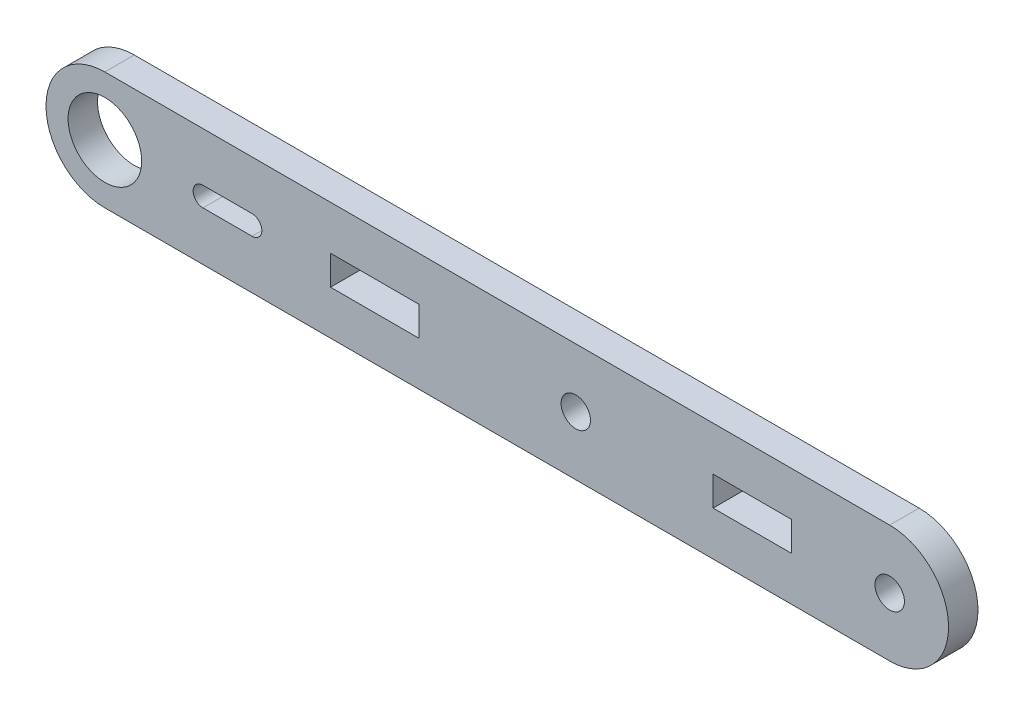
ISO-10303-21;
HEADER;
FILE_DESCRIPTION(('STEP AP214'),'2;1');
FILE_NAME('part.step','',(''),(''),'','','');
FILE_SCHEMA(('AUTOMOTIVE_DESIGN { 1 0 10303 214 1 1 1 1 }'));
ENDSEC;
DATA;
#1=APPLICATION_CONTEXT('core data for automotive mechanical design processes');
#2=APPLICATION_PROTOCOL_DEFINITION('international standard','automotive_design',2000,#1);
#3=PRODUCT_CONTEXT('',#1,'mechanical');
#4=PRODUCT('Part','Part','',(#3));
#5=PRODUCT_RELATED_PRODUCT_CATEGORY('part','',(#4));
#6=PRODUCT_DEFINITION_FORMATION('','',#4);
#7=PRODUCT_DEFINITION_CONTEXT('part definition',#1,'design');
#8=PRODUCT_DEFINITION('design','',#6,#7);
#9=PRODUCT_DEFINITION_SHAPE('','',#8);
#10=(LENGTH_UNIT() NAMED_UNIT(*) SI_UNIT(.MILLI.,.METRE.));
#11=(NAMED_UNIT(*) PLANE_ANGLE_UNIT() SI_UNIT($,.RADIAN.));
#12=(NAMED_UNIT(*) SI_UNIT($,.STERADIAN.) SOLID_ANGLE_UNIT());
#13=UNCERTAINTY_MEASURE_WITH_UNIT(LENGTH_MEASURE(1.E-05),#10,'distance_accuracy_value','');
#14=(GEOMETRIC_REPRESENTATION_CONTEXT(3) GLOBAL_UNCERTAINTY_ASSIGNED_CONTEXT((#13)) GLOBAL_UNIT_ASSIGNED_CONTEXT((#10,
#11,#12)) REPRESENTATION_CONTEXT('',''));
#15=CARTESIAN_POINT('',(0.,0.,0.));
#16=DIRECTION('',(0.,0.,1.));
#17=DIRECTION('',(1.,0.,0.));
#18=AXIS2_PLACEMENT_3D('',#15,#16,#17);
#19=CARTESIAN_POINT('',(-63.0402925118679,-53.50506394828,3.));
#20=DIRECTION('',(0.,0.,1.));
#21=DIRECTION('',(1.,0.,0.));
#22=AXIS2_PLACEMENT_3D('',#19,#20,#21);
#23=PLANE('',#22);
#24=DIRECTION('',(-1.,0.,0.));
#25=VECTOR('',#24,1.);
#26=CARTESIAN_POINT('',(6.95970748813215,-52.00506394828,3.));
#27=LINE('',#26,#25);
#28=CARTESIAN_POINT('',(6.95970748813215,-52.00506394828,3.));
#29=VERTEX_POINT('',#28);
#30=CARTESIAN_POINT('',(-1.04029251186785,-52.00506394828,3.));
#31=VERTEX_POINT('',#30);
#32=EDGE_CURVE('E185',#29,#31,#27,.T.);
#33=ORIENTED_EDGE('',*,*,#32,.F.);
#34=DIRECTION('',(0.,1.,0.));
#35=VECTOR('',#34,1.);
#36=CARTESIAN_POINT('',(6.95970748813215,-55.00506394828,3.));
#37=LINE('',#36,#35);
#38=CARTESIAN_POINT('',(6.95970748813215,-55.00506394828,3.));
#39=VERTEX_POINT('',#38);
#40=EDGE_CURVE('E183',#39,#29,#37,.T.);
#41=ORIENTED_EDGE('',*,*,#40,.F.);
#42=DIRECTION('',(1.,0.,0.));
#43=VECTOR('',#42,1.);
#44=CARTESIAN_POINT('',(6.95970748813215,-55.00506394828,3.));
#45=LINE('',#44,#43);
#46=CARTESIAN_POINT('',(-1.04029251186784,-55.00506394828,3.));
#47=VERTEX_POINT('',#46);
#48=EDGE_CURVE('E191',#47,#39,#45,.T.);
#49=ORIENTED_EDGE('',*,*,#48,.F.);
#50=DIRECTION('',(0.,-1.,0.));
#51=VECTOR('',#50,1.);
#52=CARTESIAN_POINT('',(-1.04029251186785,-55.00506394828,3.));
#53=LINE('',#52,#51);
#54=EDGE_CURVE('E188',#31,#47,#53,.T.);
#55=ORIENTED_EDGE('',*,*,#54,.F.);
#56=EDGE_LOOP('',(#33,#41,#49,#55));
#57=FACE_BOUND('',#56,.T.);
#58=CARTESIAN_POINT('',(-63.0402925118679,-53.50506394828,3.));
#59=DIRECTION('',(0.,0.,1.));
#60=DIRECTION('',(1.,0.,0.));
#61=AXIS2_PLACEMENT_3D('',#58,#59,#60);
#62=CIRCLE('',#61,3.75000000000001);
#63=CARTESIAN_POINT('',(-59.2902925118678,-53.50506394828,3.));
#64=VERTEX_POINT('',#63);
#65=EDGE_CURVE('E245',#64,#64,#62,.T.);
#66=ORIENTED_EDGE('',*,*,#65,.F.);
#67=EDGE_LOOP('',(#66));
#68=FACE_BOUND('',#67,.T.);
#69=CARTESIAN_POINT('',(-15.0402925118679,-53.50506394828,3.));
#70=DIRECTION('',(0.,0.,1.));
#71=DIRECTION('',(1.,0.,0.));
#72=AXIS2_PLACEMENT_3D('',#69,#70,#71);
#73=CIRCLE('',#72,1.5);
#74=CARTESIAN_POINT('',(-13.5402925118679,-53.50506394828,3.));
#75=VERTEX_POINT('',#74);
#76=EDGE_CURVE('E257',#75,#75,#73,.T.);
#77=ORIENTED_EDGE('',*,*,#76,.F.);
#78=EDGE_LOOP('',(#77));
#79=FACE_BOUND('',#78,.T.);
#80=CARTESIAN_POINT('',(-63.0402925118679,-53.50506394828,3.));
#81=DIRECTION('',(0.,0.,1.));
#82=DIRECTION('',(1.,0.,0.));
#83=AXIS2_PLACEMENT_3D('',#80,#81,#82);
#84=CIRCLE('',#83,6.);
#85=CARTESIAN_POINT('',(-63.0402925118679,-47.50506394828,3.));
#86=VERTEX_POINT('',#85);
#87=CARTESIAN_POINT('',(-63.0402925118679,-59.50506394828,3.));
#88=VERTEX_POINT('',#87);
#89=EDGE_CURVE('E263',#86,#88,#84,.T.);
#90=ORIENTED_EDGE('',*,*,#89,.T.);
#91=DIRECTION('',(1.,0.,0.));
#92=VECTOR('',#91,1.);
#93=CARTESIAN_POINT('',(-63.0402925118679,-59.50506394828,3.));
#94=LINE('',#93,#92);
#95=CARTESIAN_POINT('',(16.9597074881321,-59.50506394828,3.));
#96=VERTEX_POINT('',#95);
#97=EDGE_CURVE('E266',#88,#96,#94,.T.);
#98=ORIENTED_EDGE('',*,*,#97,.T.);
#99=CARTESIAN_POINT('',(16.9597074881321,-53.50506394828,3.));
#100=DIRECTION('',(0.,0.,1.));
#101=DIRECTION('',(1.,0.,0.));
#102=AXIS2_PLACEMENT_3D('',#99,#100,#101);
#103=CIRCLE('',#102,6.00000000000001);
#104=CARTESIAN_POINT('',(16.9597074881321,-47.50506394828,3.));
#105=VERTEX_POINT('',#104);
#106=EDGE_CURVE('E269',#96,#105,#103,.T.);
#107=ORIENTED_EDGE('',*,*,#106,.T.);
#108=DIRECTION('',(-1.,0.,0.));
#109=VECTOR('',#108,1.);
#110=CARTESIAN_POINT('',(-63.0402925118679,-47.50506394828,3.));
#111=LINE('',#110,#109);
#112=EDGE_CURVE('E271',#105,#86,#111,.T.);
#113=ORIENTED_EDGE('',*,*,#112,.T.);
#114=EDGE_LOOP('',(#90,#98,#107,#113));
#115=FACE_BOUND('',#114,.T.);
#116=CARTESIAN_POINT('',(16.9597074881321,-53.50506394828,3.));
#117=DIRECTION('',(0.,0.,1.));
#118=DIRECTION('',(1.,0.,0.));
#119=AXIS2_PLACEMENT_3D('',#116,#117,#118);
#120=CIRCLE('',#119,1.50000000000002);
#121=CARTESIAN_POINT('',(18.4597074881322,-53.50506394828,3.));
#122=VERTEX_POINT('',#121);
#123=EDGE_CURVE('E251',#122,#122,#120,.T.);
#124=ORIENTED_EDGE('',*,*,#123,.F.);
#125=EDGE_LOOP('',(#124));
#126=FACE_BOUND('',#125,.T.);
#127=DIRECTION('',(-1.,0.,0.));
#128=VECTOR('',#127,1.);
#129=CARTESIAN_POINT('',(-31.0402925118678,-52.00506394828,3.));
#130=LINE('',#129,#128);
#131=CARTESIAN_POINT('',(-31.0402925118678,-52.00506394828,3.));
#132=VERTEX_POINT('',#131);
#133=CARTESIAN_POINT('',(-40.0402925118678,-52.00506394828,3.));
#134=VERTEX_POINT('',#133);
#135=EDGE_CURVE('E216',#132,#134,#130,.T.);
#136=ORIENTED_EDGE('',*,*,#135,.F.);
#137=DIRECTION('',(0.,1.,0.));
#138=VECTOR('',#137,1.);
#139=CARTESIAN_POINT('',(-31.0402925118678,-55.00506394828,3.));
#140=LINE('',#139,#138);
#141=CARTESIAN_POINT('',(-31.0402925118678,-55.00506394828,3.));
#142=VERTEX_POINT('',#141);
#143=EDGE_CURVE('E214',#142,#132,#140,.T.);
#144=ORIENTED_EDGE('',*,*,#143,.F.);
#145=DIRECTION('',(1.,0.,0.));
#146=VECTOR('',#145,1.);
#147=CARTESIAN_POINT('',(-31.0402925118678,-55.00506394828,3.));
#148=LINE('',#147,#146);
#149=CARTESIAN_POINT('',(-40.0402925118678,-55.00506394828,3.));
#150=VERTEX_POINT('',#149);
#151=EDGE_CURVE('E222',#150,#142,#148,.T.);
#152=ORIENTED_EDGE('',*,*,#151,.F.);
#153=DIRECTION('',(0.,-1.,0.));
#154=VECTOR('',#153,1.);
#155=CARTESIAN_POINT('',(-40.0402925118678,-55.00506394828,3.));
#156=LINE('',#155,#154);
#157=EDGE_CURVE('E219',#134,#150,#156,.T.);
#158=ORIENTED_EDGE('',*,*,#157,.F.);
#159=EDGE_LOOP('',(#136,#144,#152,#158));
#160=FACE_BOUND('',#159,.T.);
#161=DIRECTION('',(1.,0.,0.));
#162=VECTOR('',#161,1.);
#163=CARTESIAN_POINT('',(-53.0402925118678,-54.50506394828,3.));
#164=LINE('',#163,#162);
#165=CARTESIAN_POINT('',(-53.0402925118678,-54.50506394828,3.));
#166=VERTEX_POINT('',#165);
#167=CARTESIAN_POINT('',(-48.0402925118679,-54.50506394828,3.));
#168=VERTEX_POINT('',#167);
#169=EDGE_CURVE('E155',#166,#168,#164,.T.);
#170=ORIENTED_EDGE('',*,*,#169,.F.);
#171=CARTESIAN_POINT('',(-53.0402925118678,-53.50506394828,3.));
#172=DIRECTION('',(0.,0.,1.));
#173=DIRECTION('',(1.,0.,0.));
#174=AXIS2_PLACEMENT_3D('',#171,#172,#173);
#175=CIRCLE('',#174,1.);
#176=CARTESIAN_POINT('',(-53.0402925118678,-52.50506394828,3.));
#177=VERTEX_POINT('',#176);
#178=EDGE_CURVE('E147',#177,#166,#175,.T.);
#179=ORIENTED_EDGE('',*,*,#178,.F.);
#180=DIRECTION('',(-1.,0.,0.));
#181=VECTOR('',#180,1.);
#182=CARTESIAN_POINT('',(-53.0402925118678,-52.50506394828,3.));
#183=LINE('',#182,#181);
#184=CARTESIAN_POINT('',(-48.0402925118679,-52.50506394828,3.));
#185=VERTEX_POINT('',#184);
#186=EDGE_CURVE('E169',#185,#177,#183,.T.);
#187=ORIENTED_EDGE('',*,*,#186,.F.);
#188=CARTESIAN_POINT('',(-48.0402925118679,-53.50506394828,3.));
#189=DIRECTION('',(0.,0.,1.));
#190=DIRECTION('',(1.,0.,0.));
#191=AXIS2_PLACEMENT_3D('',#188,#189,#190);
#192=CIRCLE('',#191,1.);
#193=EDGE_CURVE('E167',#168,#185,#192,.T.);
#194=ORIENTED_EDGE('',*,*,#193,.F.);
#195=EDGE_LOOP('',(#170,#179,#187,#194));
#196=FACE_BOUND('',#195,.T.);
#197=ADVANCED_FACE('F34',(#57,#68,#79,#115,#126,#160,#196),#23,.T.);
#198=CARTESIAN_POINT('',(-63.0402925118679,-53.50506394828,0.));
#199=DIRECTION('',(0.,0.,1.));
#200=DIRECTION('',(1.,0.,0.));
#201=AXIS2_PLACEMENT_3D('',#198,#199,#200);
#202=PLANE('',#201);
#203=DIRECTION('',(0.,1.,0.));
#204=VECTOR('',#203,1.);
#205=CARTESIAN_POINT('',(6.95970748813215,-55.00506394828,0.));
#206=LINE('',#205,#204);
#207=CARTESIAN_POINT('',(6.95970748813216,-55.00506394828,0.));
#208=VERTEX_POINT('',#207);
#209=CARTESIAN_POINT('',(6.95970748813215,-52.00506394828,0.));
#210=VERTEX_POINT('',#209);
#211=EDGE_CURVE('E163',#208,#210,#206,.T.);
#212=ORIENTED_EDGE('',*,*,#211,.T.);
#213=DIRECTION('',(-1.,0.,0.));
#214=VECTOR('',#213,1.);
#215=CARTESIAN_POINT('',(6.95970748813215,-52.00506394828,0.));
#216=LINE('',#215,#214);
#217=CARTESIAN_POINT('',(-1.04029251186785,-52.00506394828,0.));
#218=VERTEX_POINT('',#217);
#219=EDGE_CURVE('E196',#210,#218,#216,.T.);
#220=ORIENTED_EDGE('',*,*,#219,.T.);
#221=DIRECTION('',(0.,-1.,0.));
#222=VECTOR('',#221,1.);
#223=CARTESIAN_POINT('',(-1.04029251186785,-55.00506394828,0.));
#224=LINE('',#223,#222);
#225=CARTESIAN_POINT('',(-1.04029251186785,-55.00506394828,0.));
#226=VERTEX_POINT('',#225);
#227=EDGE_CURVE('E199',#218,#226,#224,.T.);
#228=ORIENTED_EDGE('',*,*,#227,.T.);
#229=DIRECTION('',(1.,0.,0.));
#230=VECTOR('',#229,1.);
#231=CARTESIAN_POINT('',(6.95970748813215,-55.00506394828,0.));
#232=LINE('',#231,#230);
#233=EDGE_CURVE('E186',#226,#208,#232,.T.);
#234=ORIENTED_EDGE('',*,*,#233,.T.);
#235=EDGE_LOOP('',(#212,#220,#228,#234));
#236=FACE_BOUND('',#235,.T.);
#237=CARTESIAN_POINT('',(-63.0402925118679,-53.50506394828,0.));
#238=DIRECTION('',(0.,0.,1.));
#239=DIRECTION('',(1.,0.,0.));
#240=AXIS2_PLACEMENT_3D('',#237,#238,#239);
#241=CIRCLE('',#240,3.75000000000001);
#242=CARTESIAN_POINT('',(-59.2902925118678,-53.50506394828,0.));
#243=VERTEX_POINT('',#242);
#244=EDGE_CURVE('E244',#243,#243,#241,.T.);
#245=ORIENTED_EDGE('',*,*,#244,.T.);
#246=EDGE_LOOP('',(#245));
#247=FACE_BOUND('',#246,.T.);
#248=CARTESIAN_POINT('',(-15.0402925118679,-53.50506394828,0.));
#249=DIRECTION('',(0.,0.,1.));
#250=DIRECTION('',(1.,0.,0.));
#251=AXIS2_PLACEMENT_3D('',#248,#249,#250);
#252=CIRCLE('',#251,1.5);
#253=CARTESIAN_POINT('',(-13.5402925118679,-53.50506394828,0.));
#254=VERTEX_POINT('',#253);
#255=EDGE_CURVE('E254',#254,#254,#252,.T.);
#256=ORIENTED_EDGE('',*,*,#255,.T.);
#257=EDGE_LOOP('',(#256));
#258=FACE_BOUND('',#257,.T.);
#259=CARTESIAN_POINT('',(-63.0402925118679,-53.50506394828,0.));
#260=DIRECTION('',(0.,0.,1.));
#261=DIRECTION('',(1.,0.,0.));
#262=AXIS2_PLACEMENT_3D('',#259,#260,#261);
#263=CIRCLE('',#262,6.);
#264=CARTESIAN_POINT('',(-63.0402925118679,-47.50506394828,0.));
#265=VERTEX_POINT('',#264);
#266=CARTESIAN_POINT('',(-63.0402925118679,-59.50506394828,0.));
#267=VERTEX_POINT('',#266);
#268=EDGE_CURVE('E260',#265,#267,#263,.T.);
#269=ORIENTED_EDGE('',*,*,#268,.F.);
#270=DIRECTION('',(-1.,0.,0.));
#271=VECTOR('',#270,1.);
#272=CARTESIAN_POINT('',(-63.0402925118679,-47.50506394828,0.));
#273=LINE('',#272,#271);
#274=CARTESIAN_POINT('',(16.9597074881321,-47.50506394828,0.));
#275=VERTEX_POINT('',#274);
#276=EDGE_CURVE('E267',#275,#265,#273,.T.);
#277=ORIENTED_EDGE('',*,*,#276,.F.);
#278=CARTESIAN_POINT('',(16.9597074881321,-53.50506394828,0.));
#279=DIRECTION('',(0.,0.,1.));
#280=DIRECTION('',(1.,0.,0.));
#281=AXIS2_PLACEMENT_3D('',#278,#279,#280);
#282=CIRCLE('',#281,6.00000000000001);
#283=CARTESIAN_POINT('',(16.9597074881321,-59.50506394828,0.));
#284=VERTEX_POINT('',#283);
#285=EDGE_CURVE('E278',#284,#275,#282,.T.);
#286=ORIENTED_EDGE('',*,*,#285,.F.);
#287=DIRECTION('',(1.,0.,0.));
#288=VECTOR('',#287,1.);
#289=CARTESIAN_POINT('',(-63.0402925118679,-59.50506394828,0.));
#290=LINE('',#289,#288);
#291=EDGE_CURVE('E276',#267,#284,#290,.T.);
#292=ORIENTED_EDGE('',*,*,#291,.F.);
#293=EDGE_LOOP('',(#269,#277,#286,#292));
#294=FACE_BOUND('',#293,.T.);
#295=CARTESIAN_POINT('',(16.9597074881321,-53.50506394828,0.));
#296=DIRECTION('',(0.,0.,1.));
#297=DIRECTION('',(1.,0.,0.));
#298=AXIS2_PLACEMENT_3D('',#295,#296,#297);
#299=CIRCLE('',#298,1.50000000000002);
#300=CARTESIAN_POINT('',(18.4597074881322,-53.50506394828,0.));
#301=VERTEX_POINT('',#300);
#302=EDGE_CURVE('E248',#301,#301,#299,.T.);
#303=ORIENTED_EDGE('',*,*,#302,.T.);
#304=EDGE_LOOP('',(#303));
#305=FACE_BOUND('',#304,.T.);
#306=DIRECTION('',(0.,1.,0.));
#307=VECTOR('',#306,1.);
#308=CARTESIAN_POINT('',(-31.0402925118678,-55.00506394828,0.));
#309=LINE('',#308,#307);
#310=CARTESIAN_POINT('',(-31.0402925118679,-55.00506394828,0.));
#311=VERTEX_POINT('',#310);
#312=CARTESIAN_POINT('',(-31.0402925118678,-52.00506394828,0.));
#313=VERTEX_POINT('',#312);
#314=EDGE_CURVE('E213',#311,#313,#309,.T.);
#315=ORIENTED_EDGE('',*,*,#314,.T.);
#316=DIRECTION('',(-1.,0.,0.));
#317=VECTOR('',#316,1.);
#318=CARTESIAN_POINT('',(-31.0402925118678,-52.00506394828,0.));
#319=LINE('',#318,#317);
#320=CARTESIAN_POINT('',(-40.0402925118678,-52.00506394828,0.));
#321=VERTEX_POINT('',#320);
#322=EDGE_CURVE('E227',#313,#321,#319,.T.);
#323=ORIENTED_EDGE('',*,*,#322,.T.);
#324=DIRECTION('',(0.,-1.,0.));
#325=VECTOR('',#324,1.);
#326=CARTESIAN_POINT('',(-40.0402925118678,-55.00506394828,0.));
#327=LINE('',#326,#325);
#328=CARTESIAN_POINT('',(-40.0402925118678,-55.00506394828,0.));
#329=VERTEX_POINT('',#328);
#330=EDGE_CURVE('E230',#321,#329,#327,.T.);
#331=ORIENTED_EDGE('',*,*,#330,.T.);
#332=DIRECTION('',(1.,0.,0.));
#333=VECTOR('',#332,1.);
#334=CARTESIAN_POINT('',(-31.0402925118678,-55.00506394828,0.));
#335=LINE('',#334,#333);
#336=EDGE_CURVE('E217',#329,#311,#335,.T.);
#337=ORIENTED_EDGE('',*,*,#336,.T.);
#338=EDGE_LOOP('',(#315,#323,#331,#337));
#339=FACE_BOUND('',#338,.T.);
#340=CARTESIAN_POINT('',(-53.0402925118678,-53.50506394828,0.));
#341=DIRECTION('',(0.,0.,1.));
#342=DIRECTION('',(1.,0.,0.));
#343=AXIS2_PLACEMENT_3D('',#340,#341,#342);
#344=CIRCLE('',#343,1.);
#345=CARTESIAN_POINT('',(-53.0402925118678,-52.50506394828,0.));
#346=VERTEX_POINT('',#345);
#347=CARTESIAN_POINT('',(-53.0402925118678,-54.50506394828,0.));
#348=VERTEX_POINT('',#347);
#349=EDGE_CURVE('E57',#346,#348,#344,.T.);
#350=ORIENTED_EDGE('',*,*,#349,.T.);
#351=DIRECTION('',(1.,0.,0.));
#352=VECTOR('',#351,1.);
#353=CARTESIAN_POINT('',(-53.0402925118678,-54.50506394828,0.));
#354=LINE('',#353,#352);
#355=CARTESIAN_POINT('',(-48.0402925118679,-54.50506394828,0.));
#356=VERTEX_POINT('',#355);
#357=EDGE_CURVE('E162',#348,#356,#354,.T.);
#358=ORIENTED_EDGE('',*,*,#357,.T.);
#359=CARTESIAN_POINT('',(-48.0402925118679,-53.50506394828,0.));
#360=DIRECTION('',(0.,0.,1.));
#361=DIRECTION('',(1.,0.,0.));
#362=AXIS2_PLACEMENT_3D('',#359,#360,#361);
#363=CIRCLE('',#362,1.);
#364=CARTESIAN_POINT('',(-48.0402925118679,-52.50506394828,0.));
#365=VERTEX_POINT('',#364);
#366=EDGE_CURVE('E175',#356,#365,#363,.T.);
#367=ORIENTED_EDGE('',*,*,#366,.T.);
#368=DIRECTION('',(-1.,0.,0.));
#369=VECTOR('',#368,1.);
#370=CARTESIAN_POINT('',(-53.0402925118678,-52.50506394828,0.));
#371=LINE('',#370,#369);
#372=EDGE_CURVE('E156',#365,#346,#371,.T.);
#373=ORIENTED_EDGE('',*,*,#372,.T.);
#374=EDGE_LOOP('',(#350,#358,#367,#373));
#375=FACE_BOUND('',#374,.T.);
#376=ADVANCED_FACE('F296',(#236,#247,#258,#294,#305,#339,#375),#202,.F.);
#377=CARTESIAN_POINT('',(-63.0402925118679,-53.50506394828,3.));
#378=DIRECTION('',(0.,0.,-1.));
#379=DIRECTION('',(-1.,0.,0.));
#380=AXIS2_PLACEMENT_3D('',#377,#378,#379);
#381=CYLINDRICAL_SURFACE('',#380,6.);
#382=ORIENTED_EDGE('',*,*,#268,.T.);
#383=DIRECTION('',(0.,0.,-1.));
#384=VECTOR('',#383,1.);
#385=CARTESIAN_POINT('',(-63.0402925118679,-59.50506394828,3.));
#386=LINE('',#385,#384);
#387=EDGE_CURVE('E11',#88,#267,#386,.T.);
#388=ORIENTED_EDGE('',*,*,#387,.F.);
#389=ORIENTED_EDGE('',*,*,#89,.F.);
#390=DIRECTION('',(0.,0.,-1.));
#391=VECTOR('',#390,1.);
#392=CARTESIAN_POINT('',(-63.0402925118679,-47.50506394828,3.));
#393=LINE('',#392,#391);
#394=EDGE_CURVE('E273',#86,#265,#393,.T.);
#395=ORIENTED_EDGE('',*,*,#394,.T.);
#396=EDGE_LOOP('',(#382,#388,#389,#395));
#397=FACE_BOUND('',#396,.T.);
#398=ADVANCED_FACE('F36',(#397),#381,.T.);
#399=CARTESIAN_POINT('',(-63.0402925118679,-59.50506394828,3.));
#400=DIRECTION('',(0.,1.,0.));
#401=DIRECTION('',(-1.,0.,0.));
#402=AXIS2_PLACEMENT_3D('',#399,#400,#401);
#403=PLANE('',#402);
#404=ORIENTED_EDGE('',*,*,#291,.T.);
#405=DIRECTION('',(0.,0.,-1.));
#406=VECTOR('',#405,1.);
#407=CARTESIAN_POINT('',(16.9597074881321,-59.50506394828,3.));
#408=LINE('',#407,#406);
#409=EDGE_CURVE('E42',#96,#284,#408,.T.);
#410=ORIENTED_EDGE('',*,*,#409,.F.);
#411=ORIENTED_EDGE('',*,*,#97,.F.);
#412=ORIENTED_EDGE('',*,*,#387,.T.);
#413=EDGE_LOOP('',(#404,#410,#411,#412));
#414=FACE_BOUND('',#413,.T.);
#415=ADVANCED_FACE('F307',(#414),#403,.F.);
#416=CARTESIAN_POINT('',(16.9597074881321,-53.50506394828,3.));
#417=DIRECTION('',(0.,0.,-1.));
#418=DIRECTION('',(-1.,0.,0.));
#419=AXIS2_PLACEMENT_3D('',#416,#417,#418);
#420=CYLINDRICAL_SURFACE('',#419,6.00000000000001);
#421=ORIENTED_EDGE('',*,*,#285,.T.);
#422=DIRECTION('',(0.,0.,-1.));
#423=VECTOR('',#422,1.);
#424=CARTESIAN_POINT('',(16.9597074881321,-47.50506394828,3.));
#425=LINE('',#424,#423);
#426=EDGE_CURVE('E283',#105,#275,#425,.T.);
#427=ORIENTED_EDGE('',*,*,#426,.F.);
#428=ORIENTED_EDGE('',*,*,#106,.F.);
#429=ORIENTED_EDGE('',*,*,#409,.T.);
#430=EDGE_LOOP('',(#421,#427,#428,#429));
#431=FACE_BOUND('',#430,.T.);
#432=ADVANCED_FACE('F290',(#431),#420,.T.);
#433=CARTESIAN_POINT('',(-63.0402925118679,-47.50506394828,3.));
#434=DIRECTION('',(0.,-1.,0.));
#435=DIRECTION('',(1.,0.,0.));
#436=AXIS2_PLACEMENT_3D('',#433,#434,#435);
#437=PLANE('',#436);
#438=ORIENTED_EDGE('',*,*,#276,.T.);
#439=ORIENTED_EDGE('',*,*,#394,.F.);
#440=ORIENTED_EDGE('',*,*,#112,.F.);
#441=ORIENTED_EDGE('',*,*,#426,.T.);
#442=EDGE_LOOP('',(#438,#439,#440,#441));
#443=FACE_BOUND('',#442,.T.);
#444=ADVANCED_FACE('F300',(#443),#437,.F.);
#445=CARTESIAN_POINT('',(-15.0402925118679,-53.50506394828,3.));
#446=DIRECTION('',(0.,0.,-1.));
#447=DIRECTION('',(-1.,0.,0.));
#448=AXIS2_PLACEMENT_3D('',#445,#446,#447);
#449=CYLINDRICAL_SURFACE('',#448,1.5);
#450=ORIENTED_EDGE('',*,*,#76,.T.);
#451=EDGE_LOOP('',(#450));
#452=FACE_BOUND('',#451,.T.);
#453=ORIENTED_EDGE('',*,*,#255,.F.);
#454=EDGE_LOOP('',(#453));
#455=FACE_BOUND('',#454,.T.);
#456=ADVANCED_FACE('F325',(#452,#455),#449,.F.);
#457=CARTESIAN_POINT('',(16.9597074881321,-53.50506394828,3.));
#458=DIRECTION('',(0.,0.,-1.));
#459=DIRECTION('',(-1.,0.,0.));
#460=AXIS2_PLACEMENT_3D('',#457,#458,#459);
#461=CYLINDRICAL_SURFACE('',#460,1.50000000000002);
#462=ORIENTED_EDGE('',*,*,#123,.T.);
#463=EDGE_LOOP('',(#462));
#464=FACE_BOUND('',#463,.T.);
#465=ORIENTED_EDGE('',*,*,#302,.F.);
#466=EDGE_LOOP('',(#465));
#467=FACE_BOUND('',#466,.T.);
#468=ADVANCED_FACE('F332',(#464,#467),#461,.F.);
#469=CARTESIAN_POINT('',(-63.0402925118679,-53.50506394828,3.));
#470=DIRECTION('',(0.,0.,-1.));
#471=DIRECTION('',(-1.,0.,0.));
#472=AXIS2_PLACEMENT_3D('',#469,#470,#471);
#473=CYLINDRICAL_SURFACE('',#472,3.75000000000001);
#474=ORIENTED_EDGE('',*,*,#65,.T.);
#475=EDGE_LOOP('',(#474));
#476=FACE_BOUND('',#475,.T.);
#477=ORIENTED_EDGE('',*,*,#244,.F.);
#478=EDGE_LOOP('',(#477));
#479=FACE_BOUND('',#478,.T.);
#480=ADVANCED_FACE('F337',(#476,#479),#473,.F.);
#481=CARTESIAN_POINT('',(-31.0402925118678,-55.00506394828,3.));
#482=DIRECTION('',(-1.,0.,0.));
#483=DIRECTION('',(0.,0.,1.));
#484=AXIS2_PLACEMENT_3D('',#481,#482,#483);
#485=PLANE('',#484);
#486=ORIENTED_EDGE('',*,*,#314,.F.);
#487=DIRECTION('',(0.,0.,-1.));
#488=VECTOR('',#487,1.);
#489=CARTESIAN_POINT('',(-31.0402925118678,-55.00506394828,3.));
#490=LINE('',#489,#488);
#491=EDGE_CURVE('E224',#142,#311,#490,.T.);
#492=ORIENTED_EDGE('',*,*,#491,.F.);
#493=ORIENTED_EDGE('',*,*,#143,.T.);
#494=DIRECTION('',(0.,0.,-1.));
#495=VECTOR('',#494,1.);
#496=CARTESIAN_POINT('',(-31.0402925118678,-52.00506394828,3.));
#497=LINE('',#496,#495);
#498=EDGE_CURVE('E241',#132,#313,#497,.T.);
#499=ORIENTED_EDGE('',*,*,#498,.T.);
#500=EDGE_LOOP('',(#486,#492,#493,#499));
#501=FACE_BOUND('',#500,.T.);
#502=ADVANCED_FACE('F347',(#501),#485,.T.);
#503=CARTESIAN_POINT('',(-31.0402925118678,-52.00506394828,3.));
#504=DIRECTION('',(0.,-1.,0.));
#505=DIRECTION('',(1.,0.,0.));
#506=AXIS2_PLACEMENT_3D('',#503,#504,#505);
#507=PLANE('',#506);
#508=ORIENTED_EDGE('',*,*,#322,.F.);
#509=ORIENTED_EDGE('',*,*,#498,.F.);
#510=ORIENTED_EDGE('',*,*,#135,.T.);
#511=DIRECTION('',(0.,0.,-1.));
#512=VECTOR('',#511,1.);
#513=CARTESIAN_POINT('',(-40.0402925118678,-52.00506394828,3.));
#514=LINE('',#513,#512);
#515=EDGE_CURVE('E239',#134,#321,#514,.T.);
#516=ORIENTED_EDGE('',*,*,#515,.T.);
#517=EDGE_LOOP('',(#508,#509,#510,#516));
#518=FACE_BOUND('',#517,.T.);
#519=ADVANCED_FACE('F354',(#518),#507,.T.);
#520=CARTESIAN_POINT('',(-40.0402925118678,-55.00506394828,3.));
#521=DIRECTION('',(1.,0.,0.));
#522=DIRECTION('',(0.,0.,-1.));
#523=AXIS2_PLACEMENT_3D('',#520,#521,#522);
#524=PLANE('',#523);
#525=ORIENTED_EDGE('',*,*,#330,.F.);
#526=ORIENTED_EDGE('',*,*,#515,.F.);
#527=ORIENTED_EDGE('',*,*,#157,.T.);
#528=DIRECTION('',(0.,0.,-1.));
#529=VECTOR('',#528,1.);
#530=CARTESIAN_POINT('',(-40.0402925118678,-55.00506394828,3.));
#531=LINE('',#530,#529);
#532=EDGE_CURVE('E237',#150,#329,#531,.T.);
#533=ORIENTED_EDGE('',*,*,#532,.T.);
#534=EDGE_LOOP('',(#525,#526,#527,#533));
#535=FACE_BOUND('',#534,.T.);
#536=ADVANCED_FACE('F358',(#535),#524,.T.);
#537=CARTESIAN_POINT('',(-31.0402925118678,-55.00506394828,3.));
#538=DIRECTION('',(0.,1.,0.));
#539=DIRECTION('',(0.,0.,1.));
#540=AXIS2_PLACEMENT_3D('',#537,#538,#539);
#541=PLANE('',#540);
#542=ORIENTED_EDGE('',*,*,#336,.F.);
#543=ORIENTED_EDGE('',*,*,#532,.F.);
#544=ORIENTED_EDGE('',*,*,#151,.T.);
#545=ORIENTED_EDGE('',*,*,#491,.T.);
#546=EDGE_LOOP('',(#542,#543,#544,#545));
#547=FACE_BOUND('',#546,.T.);
#548=ADVANCED_FACE('F362',(#547),#541,.T.);
#549=CARTESIAN_POINT('',(6.95970748813215,-55.00506394828,3.));
#550=DIRECTION('',(-1.,0.,0.));
#551=DIRECTION('',(0.,-1.,0.));
#552=AXIS2_PLACEMENT_3D('',#549,#550,#551);
#553=PLANE('',#552);
#554=ORIENTED_EDGE('',*,*,#211,.F.);
#555=DIRECTION('',(0.,0.,-1.));
#556=VECTOR('',#555,1.);
#557=CARTESIAN_POINT('',(6.95970748813215,-55.00506394828,3.));
#558=LINE('',#557,#556);
#559=EDGE_CURVE('E193',#39,#208,#558,.T.);
#560=ORIENTED_EDGE('',*,*,#559,.F.);
#561=ORIENTED_EDGE('',*,*,#40,.T.);
#562=DIRECTION('',(0.,0.,-1.));
#563=VECTOR('',#562,1.);
#564=CARTESIAN_POINT('',(6.95970748813215,-52.00506394828,3.));
#565=LINE('',#564,#563);
#566=EDGE_CURVE('E210',#29,#210,#565,.T.);
#567=ORIENTED_EDGE('',*,*,#566,.T.);
#568=EDGE_LOOP('',(#554,#560,#561,#567));
#569=FACE_BOUND('',#568,.T.);
#570=ADVANCED_FACE('F366',(#569),#553,.T.);
#571=CARTESIAN_POINT('',(6.95970748813215,-52.00506394828,3.));
#572=DIRECTION('',(0.,-1.,0.));
#573=DIRECTION('',(1.,0.,0.));
#574=AXIS2_PLACEMENT_3D('',#571,#572,#573);
#575=PLANE('',#574);
#576=ORIENTED_EDGE('',*,*,#219,.F.);
#577=ORIENTED_EDGE('',*,*,#566,.F.);
#578=ORIENTED_EDGE('',*,*,#32,.T.);
#579=DIRECTION('',(0.,0.,-1.));
#580=VECTOR('',#579,1.);
#581=CARTESIAN_POINT('',(-1.04029251186785,-52.00506394828,3.));
#582=LINE('',#581,#580);
#583=EDGE_CURVE('E208',#31,#218,#582,.T.);
#584=ORIENTED_EDGE('',*,*,#583,.T.);
#585=EDGE_LOOP('',(#576,#577,#578,#584));
#586=FACE_BOUND('',#585,.T.);
#587=ADVANCED_FACE('F370',(#586),#575,.T.);
#588=CARTESIAN_POINT('',(-1.04029251186785,-55.00506394828,3.));
#589=DIRECTION('',(1.,0.,0.));
#590=DIRECTION('',(0.,1.,0.));
#591=AXIS2_PLACEMENT_3D('',#588,#589,#590);
#592=PLANE('',#591);
#593=ORIENTED_EDGE('',*,*,#227,.F.);
#594=ORIENTED_EDGE('',*,*,#583,.F.);
#595=ORIENTED_EDGE('',*,*,#54,.T.);
#596=DIRECTION('',(0.,0.,-1.));
#597=VECTOR('',#596,1.);
#598=CARTESIAN_POINT('',(-1.04029251186785,-55.00506394828,3.));
#599=LINE('',#598,#597);
#600=EDGE_CURVE('E206',#47,#226,#599,.T.);
#601=ORIENTED_EDGE('',*,*,#600,.T.);
#602=EDGE_LOOP('',(#593,#594,#595,#601));
#603=FACE_BOUND('',#602,.T.);
#604=ADVANCED_FACE('F374',(#603),#592,.T.);
#605=CARTESIAN_POINT('',(6.95970748813215,-55.00506394828,3.));
#606=DIRECTION('',(0.,1.,0.));
#607=DIRECTION('',(0.,0.,1.));
#608=AXIS2_PLACEMENT_3D('',#605,#606,#607);
#609=PLANE('',#608);
#610=ORIENTED_EDGE('',*,*,#233,.F.);
#611=ORIENTED_EDGE('',*,*,#600,.F.);
#612=ORIENTED_EDGE('',*,*,#48,.T.);
#613=ORIENTED_EDGE('',*,*,#559,.T.);
#614=EDGE_LOOP('',(#610,#611,#612,#613));
#615=FACE_BOUND('',#614,.T.);
#616=ADVANCED_FACE('F378',(#615),#609,.T.);
#617=CARTESIAN_POINT('',(-53.0402925118678,-53.50506394828,3.));
#618=DIRECTION('',(0.,0.,-1.));
#619=DIRECTION('',(-1.,0.,0.));
#620=AXIS2_PLACEMENT_3D('',#617,#618,#619);
#621=CYLINDRICAL_SURFACE('',#620,1.);
#622=ORIENTED_EDGE('',*,*,#349,.F.);
#623=DIRECTION('',(0.,0.,-1.));
#624=VECTOR('',#623,1.);
#625=CARTESIAN_POINT('',(-53.0402925118678,-52.50506394828,3.));
#626=LINE('',#625,#624);
#627=EDGE_CURVE('E151',#177,#346,#626,.T.);
#628=ORIENTED_EDGE('',*,*,#627,.F.);
#629=ORIENTED_EDGE('',*,*,#178,.T.);
#630=DIRECTION('',(0.,0.,-1.));
#631=VECTOR('',#630,1.);
#632=CARTESIAN_POINT('',(-53.0402925118678,-54.50506394828,3.));
#633=LINE('',#632,#631);
#634=EDGE_CURVE('E150',#166,#348,#633,.T.);
#635=ORIENTED_EDGE('',*,*,#634,.T.);
#636=EDGE_LOOP('',(#622,#628,#629,#635));
#637=FACE_BOUND('',#636,.T.);
#638=ADVANCED_FACE('F149',(#637),#621,.F.);
#639=CARTESIAN_POINT('',(-53.0402925118678,-54.50506394828,3.));
#640=DIRECTION('',(0.,1.,0.));
#641=DIRECTION('',(0.,0.,1.));
#642=AXIS2_PLACEMENT_3D('',#639,#640,#641);
#643=PLANE('',#642);
#644=ORIENTED_EDGE('',*,*,#357,.F.);
#645=ORIENTED_EDGE('',*,*,#634,.F.);
#646=ORIENTED_EDGE('',*,*,#169,.T.);
#647=DIRECTION('',(0.,0.,-1.));
#648=VECTOR('',#647,1.);
#649=CARTESIAN_POINT('',(-48.0402925118679,-54.50506394828,3.));
#650=LINE('',#649,#648);
#651=EDGE_CURVE('E164',#168,#356,#650,.T.);
#652=ORIENTED_EDGE('',*,*,#651,.T.);
#653=EDGE_LOOP('',(#644,#645,#646,#652));
#654=FACE_BOUND('',#653,.T.);
#655=ADVANCED_FACE('F159',(#654),#643,.T.);
#656=CARTESIAN_POINT('',(-48.0402925118679,-53.50506394828,3.));
#657=DIRECTION('',(0.,0.,-1.));
#658=DIRECTION('',(-1.,0.,0.));
#659=AXIS2_PLACEMENT_3D('',#656,#657,#658);
#660=CYLINDRICAL_SURFACE('',#659,1.);
#661=ORIENTED_EDGE('',*,*,#366,.F.);
#662=ORIENTED_EDGE('',*,*,#651,.F.);
#663=ORIENTED_EDGE('',*,*,#193,.T.);
#664=DIRECTION('',(0.,0.,-1.));
#665=VECTOR('',#664,1.);
#666=CARTESIAN_POINT('',(-48.0402925118679,-52.50506394828,3.));
#667=LINE('',#666,#665);
#668=EDGE_CURVE('E49',#185,#365,#667,.T.);
#669=ORIENTED_EDGE('',*,*,#668,.T.);
#670=EDGE_LOOP('',(#661,#662,#663,#669));
#671=FACE_BOUND('',#670,.T.);
#672=ADVANCED_FACE('F387',(#671),#660,.F.);
#673=CARTESIAN_POINT('',(-53.0402925118678,-52.50506394828,3.));
#674=DIRECTION('',(0.,-1.,0.));
#675=DIRECTION('',(0.,0.,-1.));
#676=AXIS2_PLACEMENT_3D('',#673,#674,#675);
#677=PLANE('',#676);
#678=ORIENTED_EDGE('',*,*,#372,.F.);
#679=ORIENTED_EDGE('',*,*,#668,.F.);
#680=ORIENTED_EDGE('',*,*,#186,.T.);
#681=ORIENTED_EDGE('',*,*,#627,.T.);
#682=EDGE_LOOP('',(#678,#679,#680,#681));
#683=FACE_BOUND('',#682,.T.);
#684=ADVANCED_FACE('F390',(#683),#677,.T.);
#685=CLOSED_SHELL('',(#197,#376,#398,#415,#432,#444,#456,#468,#480,#502,#519,#536,#548,#570,
#587,#604,#616,#638,#655,#672,#684));
#686=MANIFOLD_SOLID_BREP('B2',#685);
#687=ADVANCED_BREP_SHAPE_REPRESENTATION('',(#18,#686),#14);
#688=SHAPE_DEFINITION_REPRESENTATION(#9,#687);
ENDSEC;
END-ISO-10303-21;
